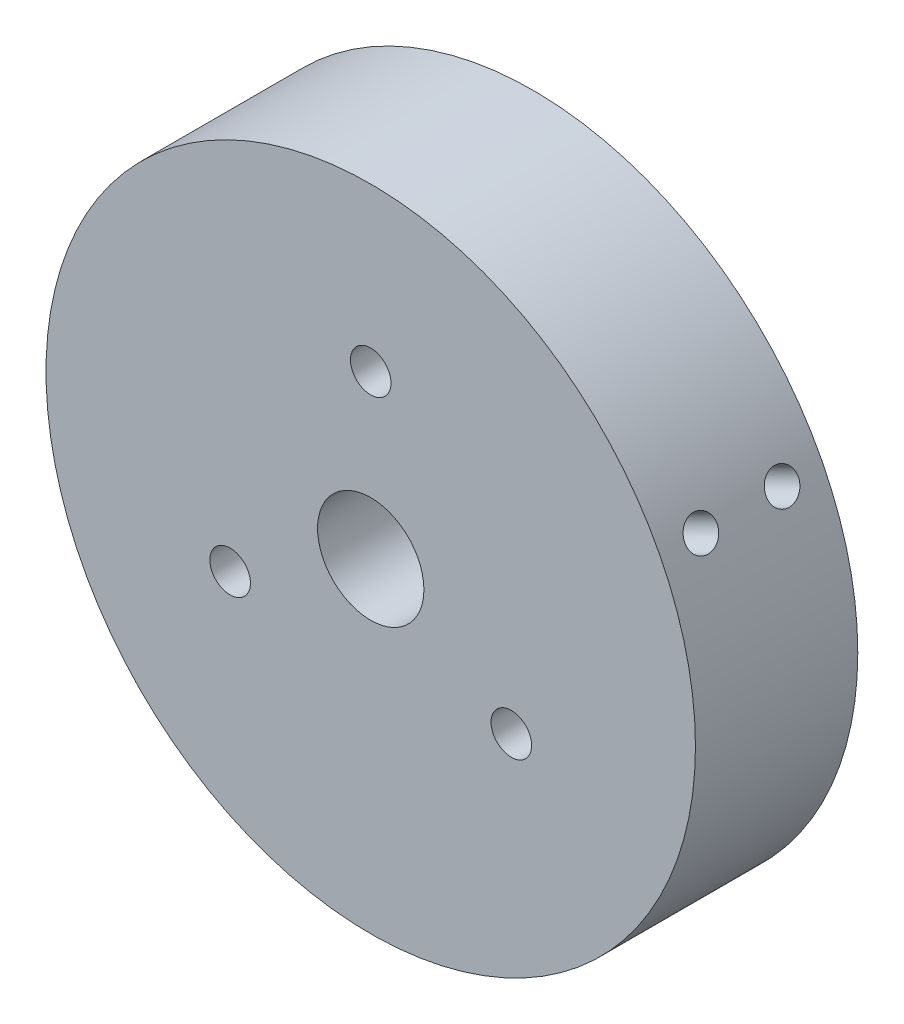
ISO-10303-21;
HEADER;
FILE_DESCRIPTION(('STEP AP214'),'2;1');
FILE_NAME('part.step','',(''),(''),'','','');
FILE_SCHEMA(('AUTOMOTIVE_DESIGN { 1 0 10303 214 1 1 1 1 }'));
ENDSEC;
DATA;
#1=APPLICATION_CONTEXT('core data for automotive mechanical design processes');
#2=APPLICATION_PROTOCOL_DEFINITION('international standard','automotive_design',2000,#1);
#3=PRODUCT_CONTEXT('',#1,'mechanical');
#4=PRODUCT('Part','Part','',(#3));
#5=PRODUCT_RELATED_PRODUCT_CATEGORY('part','',(#4));
#6=PRODUCT_DEFINITION_FORMATION('','',#4);
#7=PRODUCT_DEFINITION_CONTEXT('part definition',#1,'design');
#8=PRODUCT_DEFINITION('design','',#6,#7);
#9=PRODUCT_DEFINITION_SHAPE('','',#8);
#10=(LENGTH_UNIT() NAMED_UNIT(*) SI_UNIT(.MILLI.,.METRE.));
#11=(NAMED_UNIT(*) PLANE_ANGLE_UNIT() SI_UNIT($,.RADIAN.));
#12=(NAMED_UNIT(*) SI_UNIT($,.STERADIAN.) SOLID_ANGLE_UNIT());
#13=UNCERTAINTY_MEASURE_WITH_UNIT(LENGTH_MEASURE(1.E-05),#10,'distance_accuracy_value','');
#14=(GEOMETRIC_REPRESENTATION_CONTEXT(3) GLOBAL_UNCERTAINTY_ASSIGNED_CONTEXT((#13)) GLOBAL_UNIT_ASSIGNED_CONTEXT((#10,
#11,#12)) REPRESENTATION_CONTEXT('',''));
#15=CARTESIAN_POINT('',(0.,0.,0.));
#16=DIRECTION('',(0.,0.,1.));
#17=DIRECTION('',(1.,0.,0.));
#18=AXIS2_PLACEMENT_3D('',#15,#16,#17);
#19=CARTESIAN_POINT('',(0.,0.,10.));
#20=DIRECTION('',(0.,0.,-1.));
#21=DIRECTION('',(-1.,0.,0.));
#22=AXIS2_PLACEMENT_3D('',#19,#20,#21);
#23=CYLINDRICAL_SURFACE('',#22,20.);
#24=CARTESIAN_POINT('',(0.,0.,10.));
#25=DIRECTION('',(0.,0.,1.));
#26=DIRECTION('',(1.,0.,0.));
#27=AXIS2_PLACEMENT_3D('',#24,#25,#26);
#28=CIRCLE('',#27,20.);
#29=CARTESIAN_POINT('',(20.,0.,10.));
#30=VERTEX_POINT('',#29);
#31=EDGE_CURVE('E10',#30,#30,#28,.T.);
#32=ORIENTED_EDGE('',*,*,#31,.F.);
#33=EDGE_LOOP('',(#32));
#34=FACE_BOUND('',#33,.T.);
#35=CARTESIAN_POINT('',(0.,0.,0.));
#36=DIRECTION('',(0.,0.,1.));
#37=DIRECTION('',(1.,0.,0.));
#38=AXIS2_PLACEMENT_3D('',#35,#36,#37);
#39=CIRCLE('',#38,20.);
#40=CARTESIAN_POINT('',(20.,0.,0.));
#41=VERTEX_POINT('',#40);
#42=EDGE_CURVE('E34',#41,#41,#39,.T.);
#43=ORIENTED_EDGE('',*,*,#42,.T.);
#44=EDGE_LOOP('',(#43));
#45=FACE_BOUND('',#44,.T.);
#46=CARTESIAN_POINT('',(18.2698664851172,8.13707432779075,2.5));
#47=CARTESIAN_POINT('',(18.2698656650556,8.13707668950488,2.44386724100331));
#48=CARTESIAN_POINT('',(18.2679362451336,8.14141251511156,2.38769467418249));
#49=CARTESIAN_POINT('',(18.2602492241075,8.15863859973929,2.27689914768219));
#50=CARTESIAN_POINT('',(18.2544871124354,8.17153893801744,2.22227809299435));
#51=CARTESIAN_POINT('',(18.2392477700308,8.2054972508117,2.11620660834029));
#52=CARTESIAN_POINT('',(18.2297724331456,8.2265510667644,2.06475457753963));
#53=CARTESIAN_POINT('',(18.2072985116051,8.27617176825019,1.96646615101335));
#54=CARTESIAN_POINT('',(18.1943007585834,8.30473688033791,1.9196286693589));
#55=CARTESIAN_POINT('',(18.1650372502255,8.36855132432156,1.83183752521596));
#56=CARTESIAN_POINT('',(18.14876861008,8.40380655511825,1.79088911175391));
#57=CARTESIAN_POINT('',(18.1133231846734,8.47993410480662,1.71608322760224));
#58=CARTESIAN_POINT('',(18.0941462807608,8.52080665286746,1.68222604635527));
#59=CARTESIAN_POINT('',(18.0533139844,8.60698118957431,1.62254933043812));
#60=CARTESIAN_POINT('',(18.0316573425674,8.652285409372,1.59673387207366));
#61=CARTESIAN_POINT('',(17.9864003498086,8.74597657478419,1.55389957380047));
#62=CARTESIAN_POINT('',(17.9628000135937,8.79436349706594,1.53688066732015));
#63=CARTESIAN_POINT('',(17.9142851083139,8.89277203021169,1.51213640921778));
#64=CARTESIAN_POINT('',(17.8893716658124,8.94279222624682,1.50440322226672));
#65=CARTESIAN_POINT('',(17.8388915471291,9.04306910388663,1.49842573971104));
#66=CARTESIAN_POINT('',(17.8133248760893,9.09332578362719,1.50018136943452));
#67=CARTESIAN_POINT('',(17.7622949695299,9.1926052181231,1.51312518134678));
#68=CARTESIAN_POINT('',(17.7368316619743,9.2416290358116,1.52430492966836));
#69=CARTESIAN_POINT('',(17.6867490481536,9.33712037510001,1.55576655316963));
#70=CARTESIAN_POINT('',(17.6621297454277,9.38358788598146,1.57604846651092));
#71=CARTESIAN_POINT('',(17.6144929601877,9.47270789258768,1.62514830675197));
#72=CARTESIAN_POINT('',(17.5914762045344,9.51535865963763,1.65397007629031));
#73=CARTESIAN_POINT('',(17.5478011947027,9.59566391533399,1.71932867756906));
#74=CARTESIAN_POINT('',(17.5271429571813,9.63331836869424,1.75586556379231));
#75=CARTESIAN_POINT('',(17.488853233993,9.7026587400493,1.83566492916092));
#76=CARTESIAN_POINT('',(17.4712250857812,9.73433808051635,1.87893472554356));
#77=CARTESIAN_POINT('',(17.4396287015035,9.79083254219458,1.97094593429147));
#78=CARTESIAN_POINT('',(17.4256604664101,9.81564766158186,2.01968734811059));
#79=CARTESIAN_POINT('',(17.4018743624739,9.85775615532461,2.12126265265712));
#80=CARTESIAN_POINT('',(17.3920566277032,9.87504928670066,2.17409667552129));
#81=CARTESIAN_POINT('',(17.3769235784843,9.90165456976516,2.28235542276686));
#82=CARTESIAN_POINT('',(17.3716082301733,9.9109667814788,2.3377801276602));
#83=CARTESIAN_POINT('',(17.3656755139871,9.92135829845139,2.44958268299942));
#84=CARTESIAN_POINT('',(17.3650530661032,9.92244650609998,2.50595943656398));
#85=CARTESIAN_POINT('',(17.368515329859,9.91638477218024,2.618122236779));
#86=CARTESIAN_POINT('',(17.3726000259324,9.90923485785524,2.6739082853823));
#87=CARTESIAN_POINT('',(17.3853254115789,9.88689151278167,2.78327735716357));
#88=CARTESIAN_POINT('',(17.3939637893089,9.8717021635307,2.83686148336144));
#89=CARTESIAN_POINT('',(17.4154858645442,9.83368326279117,2.94033963108083));
#90=CARTESIAN_POINT('',(17.428369586617,9.81085366708923,2.9902336312459));
#91=CARTESIAN_POINT('',(17.4579413803482,9.75813473576173,3.08496231631947));
#92=CARTESIAN_POINT('',(17.4746327148691,9.72823934443713,3.12979261243032));
#93=CARTESIAN_POINT('',(17.5112373808973,9.66219369984117,3.21307717416153));
#94=CARTESIAN_POINT('',(17.5311507330037,9.62604340658078,3.25153139901511));
#95=CARTESIAN_POINT('',(17.5735483889071,9.54842137226089,3.32100664437919));
#96=CARTESIAN_POINT('',(17.596034953813,9.50694494710359,3.35202105220461));
#97=CARTESIAN_POINT('',(17.6428290342629,9.4198208841469,3.40569107091384));
#98=CARTESIAN_POINT('',(17.6671365418809,9.37417326450309,3.42834671817793));
#99=CARTESIAN_POINT('',(17.7167920748025,9.27998433245851,3.46464454287083));
#100=CARTESIAN_POINT('',(17.7421396058021,9.23144438987602,3.47829095070453));
#101=CARTESIAN_POINT('',(17.793115113216,9.13280544654936,3.49619677910743));
#102=CARTESIAN_POINT('',(17.8187430880471,9.08270645460324,3.50045625263933));
#103=CARTESIAN_POINT('',(17.8695061980643,8.98242191183328,3.49946679495351));
#104=CARTESIAN_POINT('',(17.8946418406264,8.9322365151634,3.49422823652193));
#105=CARTESIAN_POINT('',(17.9437552457131,8.83315946359246,3.47441286033208));
#106=CARTESIAN_POINT('',(17.9677330060564,8.78426781112852,3.45983602498397));
#107=CARTESIAN_POINT('',(18.013904385865,8.6891912223976,3.42175999898317));
#108=CARTESIAN_POINT('',(18.0360979922222,8.6430063060175,3.39826074278534));
#109=CARTESIAN_POINT('',(18.0781535086143,8.55469233466697,3.34300873599683));
#110=CARTESIAN_POINT('',(18.0980154901985,8.51256315524745,3.31125623876511));
#111=CARTESIAN_POINT('',(18.1349654585131,8.43356004681135,3.24036196822774));
#112=CARTESIAN_POINT('',(18.1520507011679,8.3966913207071,3.20121296703504));
#113=CARTESIAN_POINT('',(18.1830511957683,8.329347365772,3.11664168112384));
#114=CARTESIAN_POINT('',(18.1969656667385,8.29887371222196,3.07121785530355));
#115=CARTESIAN_POINT('',(18.2213385281724,8.24522250284338,2.97535059395517));
#116=CARTESIAN_POINT('',(18.2317935886077,8.22205197801744,2.92490238236017));
#117=CARTESIAN_POINT('',(18.2490087140092,8.18377209069065,2.82049045540655));
#118=CARTESIAN_POINT('',(18.2557731436256,8.16865320658742,2.76653097751496));
#119=CARTESIAN_POINT('',(18.2637026461476,8.1509029131412,2.67686353887427));
#120=CARTESIAN_POINT('',(18.2660119235591,8.14572421407591,2.6417363728745));
#121=CARTESIAN_POINT('',(18.2690941020448,8.13880917507727,2.57107812569735));
#122=CARTESIAN_POINT('',(18.2698670044354,8.13707283219424,2.5355470448661));
#123=CARTESIAN_POINT('',(18.2698664851172,8.13707432779075,2.5));
#124=B_SPLINE_CURVE_WITH_KNOTS('',3,(#46,#47,#48,#49,#50,#51,#52,#53,#54,#55,#56,#57,#58,#59,
#60,#61,#62,#63,#64,#65,#66,#67,#68,#69,#70,#71,#72,#73,#74,#75,#76,#77,#78,#79,#80,#81,#82,#83,
#84,#85,#86,#87,#88,#89,#90,#91,#92,#93,#94,#95,#96,#97,#98,#99,#100,#101,#102,#103,#104,#105,
#106,#107,#108,#109,#110,#111,#112,#113,#114,#115,#116,#117,#118,#119,#120,#121,#122,#123),
.UNSPECIFIED.,.T.,.F.,(4,2,2,2,2,2,2,2,2,2,2,2,2,2,2,2,2,2,2,2,2,2,2,2,2,2,2,2,2,2,2,2,2,2,2,2,
2,2,4),(0.,0.168268516567257,0.336735413977376,0.505116500205036,0.673457866663186,
0.841948360872467,1.01044573101413,1.17902837309698,1.34760973934149,1.51604875573591,
1.6844864466074,1.85277355842925,2.02106137581585,2.18942503216722,2.35778987751377,
2.52633899424335,2.69488815575804,2.86344276143662,3.03199609938987,3.20036695412688,
3.36873725206615,3.53702215286789,3.70530802753569,3.87373865699995,4.04217036331982,
4.21075122557707,4.37933135410221,4.547832267239,4.71633222966234,4.88464828436399,
5.05296465611123,5.22128226435392,5.38959470617307,5.55807248221313,5.72659171033734,
5.89527268631431,6.06375374032593,6.17031279318987,6.276871754746),.UNSPECIFIED.);
#125=CARTESIAN_POINT('',(18.2698664851172,8.13707432779075,2.5));
#126=VERTEX_POINT('',#125);
#127=EDGE_CURVE('E76',#126,#126,#124,.T.);
#128=ORIENTED_EDGE('',*,*,#127,.F.);
#129=EDGE_LOOP('',(#128));
#130=FACE_BOUND('',#129,.T.);
#131=CARTESIAN_POINT('',(18.2698664851172,8.13707432779075,7.5));
#132=CARTESIAN_POINT('',(18.2698656650556,8.13707668950488,7.44386724100331));
#133=CARTESIAN_POINT('',(18.2679362451336,8.14141251511156,7.38769467418249));
#134=CARTESIAN_POINT('',(18.2602492241075,8.15863859973929,7.27689914768219));
#135=CARTESIAN_POINT('',(18.2544871124354,8.17153893801744,7.22227809299435));
#136=CARTESIAN_POINT('',(18.2392477700308,8.2054972508117,7.11620660834029));
#137=CARTESIAN_POINT('',(18.2297724331456,8.2265510667644,7.06475457753963));
#138=CARTESIAN_POINT('',(18.2072985116051,8.27617176825019,6.96646615101335));
#139=CARTESIAN_POINT('',(18.1943007585834,8.30473688033791,6.9196286693589));
#140=CARTESIAN_POINT('',(18.1650372502255,8.36855132432156,6.83183752521596));
#141=CARTESIAN_POINT('',(18.14876861008,8.40380655511825,6.79088911175391));
#142=CARTESIAN_POINT('',(18.1133231846734,8.47993410480662,6.71608322760224));
#143=CARTESIAN_POINT('',(18.0941462807608,8.52080665286746,6.68222604635527));
#144=CARTESIAN_POINT('',(18.0533139844,8.60698118957431,6.62254933043812));
#145=CARTESIAN_POINT('',(18.0316573425674,8.652285409372,6.59673387207366));
#146=CARTESIAN_POINT('',(17.9864003498086,8.74597657478419,6.55389957380047));
#147=CARTESIAN_POINT('',(17.9628000135937,8.79436349706594,6.53688066732015));
#148=CARTESIAN_POINT('',(17.9142851083139,8.89277203021169,6.51213640921778));
#149=CARTESIAN_POINT('',(17.8893716658124,8.94279222624682,6.50440322226672));
#150=CARTESIAN_POINT('',(17.8388915471291,9.04306910388663,6.49842573971104));
#151=CARTESIAN_POINT('',(17.8133248760893,9.09332578362719,6.50018136943452));
#152=CARTESIAN_POINT('',(17.7622949695299,9.1926052181231,6.51312518134678));
#153=CARTESIAN_POINT('',(17.7368316619743,9.2416290358116,6.52430492966836));
#154=CARTESIAN_POINT('',(17.6867490481536,9.33712037510001,6.55576655316963));
#155=CARTESIAN_POINT('',(17.6621297454277,9.38358788598146,6.57604846651092));
#156=CARTESIAN_POINT('',(17.6144929601877,9.47270789258768,6.62514830675197));
#157=CARTESIAN_POINT('',(17.5914762045344,9.51535865963762,6.65397007629031));
#158=CARTESIAN_POINT('',(17.5478011947027,9.59566391533399,6.71932867756906));
#159=CARTESIAN_POINT('',(17.5271429571813,9.63331836869424,6.75586556379231));
#160=CARTESIAN_POINT('',(17.488853233993,9.7026587400493,6.83566492916092));
#161=CARTESIAN_POINT('',(17.4712250857812,9.73433808051635,6.87893472554356));
#162=CARTESIAN_POINT('',(17.4396287015035,9.79083254219458,6.97094593429147));
#163=CARTESIAN_POINT('',(17.4256604664101,9.81564766158185,7.01968734811059));
#164=CARTESIAN_POINT('',(17.4018743624739,9.8577561553246,7.12126265265712));
#165=CARTESIAN_POINT('',(17.3920566277032,9.87504928670067,7.1740966755213));
#166=CARTESIAN_POINT('',(17.3769235784843,9.90165456976516,7.28235542276686));
#167=CARTESIAN_POINT('',(17.3716082301733,9.91096678147879,7.3377801276602));
#168=CARTESIAN_POINT('',(17.3656755139871,9.92135829845139,7.44958268299942));
#169=CARTESIAN_POINT('',(17.3650530661032,9.92244650609998,7.50595943656397));
#170=CARTESIAN_POINT('',(17.368515329859,9.91638477218024,7.618122236779));
#171=CARTESIAN_POINT('',(17.3726000259324,9.90923485785524,7.6739082853823));
#172=CARTESIAN_POINT('',(17.3853254115789,9.88689151278167,7.78327735716357));
#173=CARTESIAN_POINT('',(17.3939637893089,9.87170216353069,7.83686148336144));
#174=CARTESIAN_POINT('',(17.4154858645442,9.83368326279117,7.94033963108083));
#175=CARTESIAN_POINT('',(17.428369586617,9.81085366708923,7.9902336312459));
#176=CARTESIAN_POINT('',(17.4579413803482,9.75813473576173,8.08496231631947));
#177=CARTESIAN_POINT('',(17.4746327148691,9.72823934443713,8.12979261243032));
#178=CARTESIAN_POINT('',(17.5112373808973,9.66219369984117,8.21307717416152));
#179=CARTESIAN_POINT('',(17.5311507330037,9.62604340658078,8.25153139901511));
#180=CARTESIAN_POINT('',(17.5735483889071,9.54842137226089,8.32100664437919));
#181=CARTESIAN_POINT('',(17.596034953813,9.5069449471036,8.35202105220461));
#182=CARTESIAN_POINT('',(17.6428290342629,9.4198208841469,8.40569107091384));
#183=CARTESIAN_POINT('',(17.6671365418809,9.37417326450309,8.42834671817793));
#184=CARTESIAN_POINT('',(17.7167920748025,9.27998433245851,8.46464454287083));
#185=CARTESIAN_POINT('',(17.7421396058021,9.23144438987602,8.47829095070453));
#186=CARTESIAN_POINT('',(17.793115113216,9.13280544654936,8.49619677910743));
#187=CARTESIAN_POINT('',(17.8187430880471,9.08270645460324,8.50045625263933));
#188=CARTESIAN_POINT('',(17.8695061980643,8.98242191183328,8.49946679495351));
#189=CARTESIAN_POINT('',(17.8946418406264,8.9322365151634,8.49422823652193));
#190=CARTESIAN_POINT('',(17.9437552457131,8.83315946359246,8.47441286033208));
#191=CARTESIAN_POINT('',(17.9677330060564,8.78426781112852,8.45983602498397));
#192=CARTESIAN_POINT('',(18.013904385865,8.6891912223976,8.42175999898317));
#193=CARTESIAN_POINT('',(18.0360979922222,8.6430063060175,8.39826074278534));
#194=CARTESIAN_POINT('',(18.0781535086143,8.55469233466697,8.34300873599683));
#195=CARTESIAN_POINT('',(18.0980154901985,8.51256315524745,8.3112562387651));
#196=CARTESIAN_POINT('',(18.1349654585131,8.43356004681135,8.24036196822774));
#197=CARTESIAN_POINT('',(18.1520507011679,8.39669132070709,8.20121296703504));
#198=CARTESIAN_POINT('',(18.1830511957683,8.329347365772,8.11664168112384));
#199=CARTESIAN_POINT('',(18.1969656667385,8.29887371222196,8.07121785530355));
#200=CARTESIAN_POINT('',(18.2213385281724,8.24522250284338,7.97535059395517));
#201=CARTESIAN_POINT('',(18.2317935886077,8.22205197801745,7.92490238236017));
#202=CARTESIAN_POINT('',(18.2490087140092,8.18377209069066,7.82049045540655));
#203=CARTESIAN_POINT('',(18.2557731436256,8.16865320658742,7.76653097751496));
#204=CARTESIAN_POINT('',(18.2637026461476,8.1509029131412,7.67686353887427));
#205=CARTESIAN_POINT('',(18.2660119235591,8.14572421407591,7.6417363728745));
#206=CARTESIAN_POINT('',(18.2690941020448,8.13880917507727,7.57107812569735));
#207=CARTESIAN_POINT('',(18.2698670044354,8.13707283219424,7.5355470448661));
#208=CARTESIAN_POINT('',(18.2698664851172,8.13707432779075,7.5));
#209=B_SPLINE_CURVE_WITH_KNOTS('',3,(#131,#132,#133,#134,#135,#136,#137,#138,#139,#140,#141,
#142,#143,#144,#145,#146,#147,#148,#149,#150,#151,#152,#153,#154,#155,#156,#157,#158,#159,#160,
#161,#162,#163,#164,#165,#166,#167,#168,#169,#170,#171,#172,#173,#174,#175,#176,#177,#178,#179,
#180,#181,#182,#183,#184,#185,#186,#187,#188,#189,#190,#191,#192,#193,#194,#195,#196,#197,#198,
#199,#200,#201,#202,#203,#204,#205,#206,#207,#208),.UNSPECIFIED.,.T.,.F.,(4,2,2,2,2,2,2,2,2,2,2,
2,2,2,2,2,2,2,2,2,2,2,2,2,2,2,2,2,2,2,2,2,2,2,2,2,2,2,4),(0.,0.168268516567257,
0.336735413977376,0.505116500205035,0.673457866663185,0.841948360872465,1.01044573101413,
1.17902837309698,1.34760973934149,1.51604875573591,1.6844864466074,1.85277355842925,
2.02106137581585,2.18942503216721,2.35778987751377,2.52633899424335,2.69488815575804,
2.86344276143662,3.03199609938986,3.20036695412688,3.36873725206614,3.53702215286789,
3.70530802753569,3.87373865699994,4.04217036331982,4.21075122557706,4.3793313541022,
4.54783226723899,4.71633222966233,4.88464828436398,5.05296465611123,5.22128226435392,
5.38959470617307,5.55807248221313,5.72659171033733,5.89527268631431,6.06375374032593,
6.17031279318987,6.276871754746),.UNSPECIFIED.);
#210=CARTESIAN_POINT('',(18.2698664851172,8.13707432779075,7.5));
#211=VERTEX_POINT('',#210);
#212=EDGE_CURVE('E75',#211,#211,#209,.T.);
#213=ORIENTED_EDGE('',*,*,#212,.F.);
#214=EDGE_LOOP('',(#213));
#215=FACE_BOUND('',#214,.T.);
#216=ADVANCED_FACE('F31',(#34,#45,#130,#215),#23,.T.);
#217=CARTESIAN_POINT('',(0.,0.,10.));
#218=DIRECTION('',(0.,0.,-1.));
#219=DIRECTION('',(-1.,0.,0.));
#220=AXIS2_PLACEMENT_3D('',#217,#218,#219);
#221=CYLINDRICAL_SURFACE('',#220,3.275);
#222=CARTESIAN_POINT('',(2.32979097217766,2.30167309276523,2.5));
#223=CARTESIAN_POINT('',(2.32979164666574,2.30167281336672,2.4452537602253));
#224=CARTESIAN_POINT('',(2.33313001388214,2.29830799645622,2.3905020313929));
#225=CARTESIAN_POINT('',(2.34624551129864,2.28491627439694,2.28260259615405));
#226=CARTESIAN_POINT('',(2.35602461704027,2.27488732517755,2.22945538712802));
#227=CARTESIAN_POINT('',(2.38133422440516,2.24837822289333,2.12634299136384));
#228=CARTESIAN_POINT('',(2.39685490115369,2.23190908742924,2.07637253880128));
#229=CARTESIAN_POINT('',(2.43269991464427,2.19278302399342,1.98076953095194));
#230=CARTESIAN_POINT('',(2.45302502595494,2.17012509817621,1.93513767679702));
#231=CARTESIAN_POINT('',(2.49803418767822,2.11817450710033,1.84801093879038));
#232=CARTESIAN_POINT('',(2.52282982709342,2.08870468060368,1.8066792984243));
#233=CARTESIAN_POINT('',(2.57506494321571,2.02395491026348,1.73078204911099));
#234=CARTESIAN_POINT('',(2.60250477123835,1.98867419392323,1.69621734109519));
#235=CARTESIAN_POINT('',(2.65933302172943,1.91203906287981,1.63412140113247));
#236=CARTESIAN_POINT('',(2.68875065078518,1.87057039666767,1.60675732066121));
#237=CARTESIAN_POINT('',(2.74761051173504,1.78298640643889,1.56093815883177));
#238=CARTESIAN_POINT('',(2.77705273664251,1.73687212529891,1.54248108333651));
#239=CARTESIAN_POINT('',(2.83382360004,1.64256118594102,1.51554212843931));
#240=CARTESIAN_POINT('',(2.86118899219576,1.59446640913337,1.50678145083648));
#241=CARTESIAN_POINT('',(2.91371499435635,1.49632377256248,1.49860165610499));
#242=CARTESIAN_POINT('',(2.93887608234821,1.44627633963725,1.49918050870219));
#243=CARTESIAN_POINT('',(2.98545674739629,1.3474279511754,1.50947778361065));
#244=CARTESIAN_POINT('',(3.0069723510861,1.29864032126694,1.51889415848504));
#245=CARTESIAN_POINT('',(3.0468419083207,1.20212614386663,1.54610485156707));
#246=CARTESIAN_POINT('',(3.06519565888392,1.15439966466866,1.5638997073747));
#247=CARTESIAN_POINT('',(3.09881898736415,1.06087093810307,1.6075623120457));
#248=CARTESIAN_POINT('',(3.11404924961191,1.01509836062612,1.6335236408634));
#249=CARTESIAN_POINT('',(3.1412697624128,0.927447407085535,1.69270778271423));
#250=CARTESIAN_POINT('',(3.15325922093351,0.88556998461093,1.72593236726014));
#251=CARTESIAN_POINT('',(3.17470242188038,0.805407315828616,1.80025977241514));
#252=CARTESIAN_POINT('',(3.18403599482885,0.767331882129287,1.84162390165146));
#253=CARTESIAN_POINT('',(3.19993292781576,0.698083006432946,1.93025332379727));
#254=CARTESIAN_POINT('',(3.20649599162349,0.666910302664761,1.97751924704355));
#255=CARTESIAN_POINT('',(3.21735434035745,0.612404773101699,2.07726593505105));
#256=CARTESIAN_POINT('',(3.22162569713473,0.589155559550374,2.12979517525102));
#257=CARTESIAN_POINT('',(3.22819771444564,0.552018383473779,2.23817841585899));
#258=CARTESIAN_POINT('',(3.23049904528673,0.538127237179974,2.29403127847056));
#259=CARTESIAN_POINT('',(3.2333442004284,0.520754518453056,2.40517160992827));
#260=CARTESIAN_POINT('',(3.23395228568574,0.516892719689807,2.46039803937554));
#261=CARTESIAN_POINT('',(3.23366754004988,0.518671770118082,2.57068844753783));
#262=CARTESIAN_POINT('',(3.2327749283657,0.524311231446803,2.62575244880205));
#263=CARTESIAN_POINT('',(3.22943024423569,0.544522038895858,2.73259832048395));
#264=CARTESIAN_POINT('',(3.22702125923064,0.558846209615896,2.78442872804033));
#265=CARTESIAN_POINT('',(3.22044500802785,0.595570844765104,2.88502287001306));
#266=CARTESIAN_POINT('',(3.21627746376641,0.617972586339736,2.93378611804783));
#267=CARTESIAN_POINT('',(3.20570476738429,0.670687418458805,3.02835191419147));
#268=CARTESIAN_POINT('',(3.199240979807,0.701201970861785,3.0740354542226));
#269=CARTESIAN_POINT('',(3.18369249992065,0.768716459701375,3.15983061284866));
#270=CARTESIAN_POINT('',(3.17460715728373,0.805718004468074,3.19994084521362));
#271=CARTESIAN_POINT('',(3.15300637261428,0.886561331843139,3.27507568335534));
#272=CARTESIAN_POINT('',(3.14037016832215,0.930614775084627,3.30983849971131));
#273=CARTESIAN_POINT('',(3.11151288565249,1.02296099261458,3.37132609847358));
#274=CARTESIAN_POINT('',(3.0952919801532,1.07125356239636,3.39805126836222));
#275=CARTESIAN_POINT('',(3.05927997665605,1.17011749814876,3.44244729238444));
#276=CARTESIAN_POINT('',(3.03951678507693,1.22066888525271,3.46018504404139));
#277=CARTESIAN_POINT('',(2.99652003254554,1.32270673378013,3.48626832248809));
#278=CARTESIAN_POINT('',(2.9732875059983,1.37419291248362,3.49461664249019));
#279=CARTESIAN_POINT('',(2.92486686636354,1.47436460839075,3.50146549395432));
#280=CARTESIAN_POINT('',(2.89979350310508,1.52307999607418,3.50034502380115));
#281=CARTESIAN_POINT('',(2.84769496775151,1.61839677090559,3.48919856159051));
#282=CARTESIAN_POINT('',(2.820669913324,1.66499828522381,3.47917310600413));
#283=CARTESIAN_POINT('',(2.76596649117269,1.75435749889894,3.45073875291255));
#284=CARTESIAN_POINT('',(2.73829917421251,1.79715315984153,3.43242734475326));
#285=CARTESIAN_POINT('',(2.6830886337,1.87858543772,3.38802841188998));
#286=CARTESIAN_POINT('',(2.65554543172393,1.91722135636539,3.36193958436255));
#287=CARTESIAN_POINT('',(2.60083327375666,1.99084532912381,3.30173447215909));
#288=CARTESIAN_POINT('',(2.57370628220836,2.0256720053985,3.26738278902465));
#289=CARTESIAN_POINT('',(2.52205307260131,2.08963315945581,3.19204728388523));
#290=CARTESIAN_POINT('',(2.49752761930282,2.11876596555071,3.15106152058976));
#291=CARTESIAN_POINT('',(2.45162011769839,2.17173959858924,3.06208742406078));
#292=CARTESIAN_POINT('',(2.43036001837663,2.19538695569318,3.01392050716929));
#293=CARTESIAN_POINT('',(2.39322877337863,2.23580827488214,2.91286567115628));
#294=CARTESIAN_POINT('',(2.37735520943155,2.25258532207603,2.85997988406305));
#295=CARTESIAN_POINT('',(2.35331317780285,2.27767733458587,2.75634291178037));
#296=CARTESIAN_POINT('',(2.34454062512474,2.2866620737226,2.70589303028423));
#297=CARTESIAN_POINT('',(2.33277983655315,2.29865943102596,2.60363020431367));
#298=CARTESIAN_POINT('',(2.32979033377167,2.30167335721716,2.55181756089987));
#299=CARTESIAN_POINT('',(2.32979097217766,2.30167309276523,2.5));
#300=B_SPLINE_CURVE_WITH_KNOTS('',3,(#222,#223,#224,#225,#226,#227,#228,#229,#230,#231,#232,
#233,#234,#235,#236,#237,#238,#239,#240,#241,#242,#243,#244,#245,#246,#247,#248,#249,#250,#251,
#252,#253,#254,#255,#256,#257,#258,#259,#260,#261,#262,#263,#264,#265,#266,#267,#268,#269,#270,
#271,#272,#273,#274,#275,#276,#277,#278,#279,#280,#281,#282,#283,#284,#285,#286,#287,#288,#289,
#290,#291,#292,#293,#294,#295,#296,#297,#298,#299),.UNSPECIFIED.,.T.,.F.,(4,2,2,2,2,2,2,2,2,2,2,
2,2,2,2,2,2,2,2,2,2,2,2,2,2,2,2,2,2,2,2,2,2,2,2,2,2,2,4),(0.,0.164047460823636,
0.328145262705684,0.491963552527085,0.655808271088538,0.82452214602784,0.9932584678328,
1.1656217135316,1.33794635191102,1.5051759280027,1.67236915137642,1.83404843658929,
1.99573809726653,2.15935255096621,2.32300695494822,2.49318681451993,2.66338486559955,
2.83532701336364,3.00721063399621,3.172475853941,3.33771693544904,3.49846246089171,
3.65923341297653,3.82444581973846,3.9896992459461,4.16144661914482,4.33318571134438,
4.50362696552914,4.67401750262481,4.83762129215934,5.00121522623134,5.16293250409373,
5.32467688703427,5.49173071847038,5.65883352252185,5.83114995877073,6.0033889313436,
6.15869461355951,6.31396626923269),.UNSPECIFIED.);
#301=CARTESIAN_POINT('',(2.32979097217766,2.30167309276523,2.5));
#302=VERTEX_POINT('',#301);
#303=EDGE_CURVE('E67',#302,#302,#300,.T.);
#304=ORIENTED_EDGE('',*,*,#303,.F.);
#305=EDGE_LOOP('',(#304));
#306=FACE_BOUND('',#305,.T.);
#307=CARTESIAN_POINT('',(0.,0.,10.));
#308=DIRECTION('',(0.,0.,1.));
#309=DIRECTION('',(1.,0.,0.));
#310=AXIS2_PLACEMENT_3D('',#307,#308,#309);
#311=CIRCLE('',#310,3.275);
#312=CARTESIAN_POINT('',(3.275,0.,10.));
#313=VERTEX_POINT('',#312);
#314=EDGE_CURVE('E58',#313,#313,#311,.T.);
#315=ORIENTED_EDGE('',*,*,#314,.T.);
#316=EDGE_LOOP('',(#315));
#317=FACE_BOUND('',#316,.T.);
#318=CARTESIAN_POINT('',(0.,0.,0.));
#319=DIRECTION('',(0.,0.,1.));
#320=DIRECTION('',(1.,0.,0.));
#321=AXIS2_PLACEMENT_3D('',#318,#319,#320);
#322=CIRCLE('',#321,3.275);
#323=CARTESIAN_POINT('',(3.275,0.,0.));
#324=VERTEX_POINT('',#323);
#325=EDGE_CURVE('E61',#324,#324,#322,.T.);
#326=ORIENTED_EDGE('',*,*,#325,.F.);
#327=EDGE_LOOP('',(#326));
#328=FACE_BOUND('',#327,.T.);
#329=CARTESIAN_POINT('',(2.32979097217766,2.30167309276523,7.5));
#330=CARTESIAN_POINT('',(2.32979164666574,2.30167281336672,7.4452537602253));
#331=CARTESIAN_POINT('',(2.33313001388214,2.29830799645622,7.3905020313929));
#332=CARTESIAN_POINT('',(2.34624551129864,2.28491627439694,7.28260259615405));
#333=CARTESIAN_POINT('',(2.35602461704027,2.27488732517755,7.22945538712802));
#334=CARTESIAN_POINT('',(2.38133422440516,2.24837822289333,7.12634299136384));
#335=CARTESIAN_POINT('',(2.39685490115369,2.23190908742924,7.07637253880128));
#336=CARTESIAN_POINT('',(2.43269991464427,2.19278302399342,6.98076953095194));
#337=CARTESIAN_POINT('',(2.45302502595494,2.17012509817621,6.93513767679702));
#338=CARTESIAN_POINT('',(2.49803418767822,2.11817450710033,6.84801093879038));
#339=CARTESIAN_POINT('',(2.52282982709342,2.08870468060368,6.8066792984243));
#340=CARTESIAN_POINT('',(2.57506494321571,2.02395491026348,6.73078204911099));
#341=CARTESIAN_POINT('',(2.60250477123835,1.98867419392323,6.69621734109519));
#342=CARTESIAN_POINT('',(2.65933302172943,1.91203906287981,6.63412140113247));
#343=CARTESIAN_POINT('',(2.68875065078518,1.87057039666767,6.60675732066121));
#344=CARTESIAN_POINT('',(2.74761051173505,1.78298640643889,6.56093815883177));
#345=CARTESIAN_POINT('',(2.77705273664251,1.73687212529891,6.54248108333651));
#346=CARTESIAN_POINT('',(2.83382360004,1.64256118594102,6.51554212843931));
#347=CARTESIAN_POINT('',(2.86118899219576,1.59446640913337,6.50678145083648));
#348=CARTESIAN_POINT('',(2.91371499435635,1.49632377256248,6.49860165610499));
#349=CARTESIAN_POINT('',(2.93887608234821,1.44627633963725,6.49918050870219));
#350=CARTESIAN_POINT('',(2.98545674739629,1.3474279511754,6.50947778361065));
#351=CARTESIAN_POINT('',(3.0069723510861,1.29864032126694,6.51889415848504));
#352=CARTESIAN_POINT('',(3.0468419083207,1.20212614386663,6.54610485156707));
#353=CARTESIAN_POINT('',(3.06519565888392,1.15439966466866,6.5638997073747));
#354=CARTESIAN_POINT('',(3.09881898736415,1.06087093810307,6.6075623120457));
#355=CARTESIAN_POINT('',(3.11404924961191,1.01509836062612,6.63352364086341));
#356=CARTESIAN_POINT('',(3.1412697624128,0.927447407085536,6.69270778271423));
#357=CARTESIAN_POINT('',(3.15325922093351,0.885569984610931,6.72593236726014));
#358=CARTESIAN_POINT('',(3.17470242188038,0.805407315828617,6.80025977241514));
#359=CARTESIAN_POINT('',(3.18403599482885,0.767331882129288,6.84162390165146));
#360=CARTESIAN_POINT('',(3.19993292781576,0.698083006432947,6.93025332379727));
#361=CARTESIAN_POINT('',(3.20649599162349,0.666910302664761,6.97751924704355));
#362=CARTESIAN_POINT('',(3.21735434035745,0.612404773101699,7.07726593505105));
#363=CARTESIAN_POINT('',(3.22162569713473,0.589155559550375,7.12979517525102));
#364=CARTESIAN_POINT('',(3.22819771444564,0.552018383473781,7.23817841585899));
#365=CARTESIAN_POINT('',(3.23049904528673,0.538127237179975,7.29403127847056));
#366=CARTESIAN_POINT('',(3.2333442004284,0.520754518453056,7.40517160992827));
#367=CARTESIAN_POINT('',(3.23395228568574,0.516892719689808,7.46039803937554));
#368=CARTESIAN_POINT('',(3.23366754004988,0.518671770118083,7.57068844753783));
#369=CARTESIAN_POINT('',(3.2327749283657,0.524311231446805,7.62575244880206));
#370=CARTESIAN_POINT('',(3.22943024423569,0.54452203889586,7.73259832048395));
#371=CARTESIAN_POINT('',(3.22702125923064,0.558846209615899,7.78442872804033));
#372=CARTESIAN_POINT('',(3.22044500802785,0.595570844765106,7.88502287001306));
#373=CARTESIAN_POINT('',(3.21627746376641,0.617972586339739,7.93378611804784));
#374=CARTESIAN_POINT('',(3.20570476738429,0.670687418458808,8.02835191419147));
#375=CARTESIAN_POINT('',(3.199240979807,0.701201970861787,8.0740354542226));
#376=CARTESIAN_POINT('',(3.18369249992065,0.768716459701377,8.15983061284866));
#377=CARTESIAN_POINT('',(3.17460715728373,0.805718004468077,8.19994084521362));
#378=CARTESIAN_POINT('',(3.15300637261428,0.886561331843141,8.27507568335534));
#379=CARTESIAN_POINT('',(3.14037016832215,0.930614775084627,8.30983849971131));
#380=CARTESIAN_POINT('',(3.11151288565249,1.02296099261458,8.37132609847358));
#381=CARTESIAN_POINT('',(3.0952919801532,1.07125356239636,8.39805126836222));
#382=CARTESIAN_POINT('',(3.05927997665605,1.17011749814877,8.44244729238444));
#383=CARTESIAN_POINT('',(3.03951678507693,1.22066888525272,8.46018504404138));
#384=CARTESIAN_POINT('',(2.99652003254554,1.32270673378013,8.48626832248809));
#385=CARTESIAN_POINT('',(2.9732875059983,1.37419291248362,8.49461664249019));
#386=CARTESIAN_POINT('',(2.92486686636354,1.47436460839076,8.50146549395432));
#387=CARTESIAN_POINT('',(2.89979350310508,1.52307999607418,8.50034502380115));
#388=CARTESIAN_POINT('',(2.84769496775151,1.6183967709056,8.4891985615905));
#389=CARTESIAN_POINT('',(2.820669913324,1.66499828522381,8.47917310600412));
#390=CARTESIAN_POINT('',(2.76596649117269,1.75435749889894,8.45073875291255));
#391=CARTESIAN_POINT('',(2.73829917421251,1.79715315984153,8.43242734475326));
#392=CARTESIAN_POINT('',(2.6830886337,1.87858543772,8.38802841188997));
#393=CARTESIAN_POINT('',(2.65554543172393,1.9172213563654,8.36193958436255));
#394=CARTESIAN_POINT('',(2.60083327375666,1.99084532912381,8.30173447215909));
#395=CARTESIAN_POINT('',(2.57370628220835,2.0256720053985,8.26738278902464));
#396=CARTESIAN_POINT('',(2.52205307260131,2.08963315945581,8.19204728388523));
#397=CARTESIAN_POINT('',(2.49752761930282,2.11876596555071,8.15106152058976));
#398=CARTESIAN_POINT('',(2.45162011769839,2.17173959858924,8.06208742406078));
#399=CARTESIAN_POINT('',(2.43036001837663,2.19538695569318,8.01392050716929));
#400=CARTESIAN_POINT('',(2.39322877337863,2.23580827488214,7.91286567115628));
#401=CARTESIAN_POINT('',(2.37735520943155,2.25258532207603,7.85997988406305));
#402=CARTESIAN_POINT('',(2.35331317780285,2.27767733458587,7.75634291178037));
#403=CARTESIAN_POINT('',(2.34454062512474,2.2866620737226,7.70589303028423));
#404=CARTESIAN_POINT('',(2.33277983655315,2.29865943102596,7.60363020431367));
#405=CARTESIAN_POINT('',(2.32979033377168,2.30167335721716,7.55181756089987));
#406=CARTESIAN_POINT('',(2.32979097217766,2.30167309276523,7.5));
#407=B_SPLINE_CURVE_WITH_KNOTS('',3,(#329,#330,#331,#332,#333,#334,#335,#336,#337,#338,#339,
#340,#341,#342,#343,#344,#345,#346,#347,#348,#349,#350,#351,#352,#353,#354,#355,#356,#357,#358,
#359,#360,#361,#362,#363,#364,#365,#366,#367,#368,#369,#370,#371,#372,#373,#374,#375,#376,#377,
#378,#379,#380,#381,#382,#383,#384,#385,#386,#387,#388,#389,#390,#391,#392,#393,#394,#395,#396,
#397,#398,#399,#400,#401,#402,#403,#404,#405,#406),.UNSPECIFIED.,.T.,.F.,(4,2,2,2,2,2,2,2,2,2,2,
2,2,2,2,2,2,2,2,2,2,2,2,2,2,2,2,2,2,2,2,2,2,2,2,2,2,2,4),(0.,0.164047460823636,
0.328145262705684,0.491963552527086,0.655808271088538,0.82452214602784,0.9932584678328,
1.1656217135316,1.33794635191102,1.5051759280027,1.67236915137642,1.83404843658928,
1.99573809726653,2.15935255096621,2.32300695494822,2.49318681451993,2.66338486559955,
2.83532701336363,3.00721063399621,3.172475853941,3.33771693544904,3.49846246089171,
3.65923341297653,3.82444581973846,3.9896992459461,4.16144661914482,4.33318571134438,
4.50362696552914,4.67401750262481,4.83762129215934,5.00121522623133,5.16293250409373,
5.32467688703427,5.49173071847038,5.65883352252184,5.83114995877073,6.0033889313436,
6.1586946135595,6.31396626923268),.UNSPECIFIED.);
#408=CARTESIAN_POINT('',(2.32979097217766,2.30167309276523,7.5));
#409=VERTEX_POINT('',#408);
#410=EDGE_CURVE('E64',#409,#409,#407,.T.);
#411=ORIENTED_EDGE('',*,*,#410,.F.);
#412=EDGE_LOOP('',(#411));
#413=FACE_BOUND('',#412,.T.);
#414=ADVANCED_FACE('F113',(#306,#317,#328,#413),#221,.F.);
#415=CARTESIAN_POINT('',(0.,0.,10.));
#416=DIRECTION('',(0.,0.,1.));
#417=DIRECTION('',(1.,0.,0.));
#418=AXIS2_PLACEMENT_3D('',#415,#416,#417);
#419=PLANE('',#418);
#420=CARTESIAN_POINT('',(0.,10.,10.));
#421=DIRECTION('',(0.,0.,1.));
#422=DIRECTION('',(1.,0.,0.));
#423=AXIS2_PLACEMENT_3D('',#420,#421,#422);
#424=CIRCLE('',#423,1.2504794715155);
#425=CARTESIAN_POINT('',(1.2504794715155,10.,10.));
#426=VERTEX_POINT('',#425);
#427=EDGE_CURVE('E52',#426,#426,#424,.T.);
#428=ORIENTED_EDGE('',*,*,#427,.F.);
#429=EDGE_LOOP('',(#428));
#430=FACE_BOUND('',#429,.T.);
#431=CARTESIAN_POINT('',(8.66025403784503,-4.99999999999963,10.));
#432=DIRECTION('',(0.,0.,1.));
#433=DIRECTION('',(1.,0.,0.));
#434=AXIS2_PLACEMENT_3D('',#431,#432,#433);
#435=CIRCLE('',#434,1.25047947151605);
#436=CARTESIAN_POINT('',(9.91073350936107,-4.99999999999963,10.));
#437=VERTEX_POINT('',#436);
#438=EDGE_CURVE('E41',#437,#437,#435,.T.);
#439=ORIENTED_EDGE('',*,*,#438,.F.);
#440=EDGE_LOOP('',(#439));
#441=FACE_BOUND('',#440,.T.);
#442=ORIENTED_EDGE('',*,*,#31,.T.);
#443=EDGE_LOOP('',(#442));
#444=FACE_BOUND('',#443,.T.);
#445=CARTESIAN_POINT('',(-8.66025403784375,-5.00000000000037,10.));
#446=DIRECTION('',(0.,0.,1.));
#447=DIRECTION('',(1.,0.,0.));
#448=AXIS2_PLACEMENT_3D('',#445,#446,#447);
#449=CIRCLE('',#448,1.25047947151631);
#450=CARTESIAN_POINT('',(-7.40977456632744,-5.00000000000037,10.));
#451=VERTEX_POINT('',#450);
#452=EDGE_CURVE('E46',#451,#451,#449,.T.);
#453=ORIENTED_EDGE('',*,*,#452,.F.);
#454=EDGE_LOOP('',(#453));
#455=FACE_BOUND('',#454,.T.);
#456=ORIENTED_EDGE('',*,*,#314,.F.);
#457=EDGE_LOOP('',(#456));
#458=FACE_BOUND('',#457,.T.);
#459=ADVANCED_FACE('F118',(#430,#441,#444,#455,#458),#419,.T.);
#460=CARTESIAN_POINT('',(0.,0.,0.));
#461=DIRECTION('',(0.,0.,1.));
#462=DIRECTION('',(1.,0.,0.));
#463=AXIS2_PLACEMENT_3D('',#460,#461,#462);
#464=PLANE('',#463);
#465=ORIENTED_EDGE('',*,*,#42,.F.);
#466=EDGE_LOOP('',(#465));
#467=FACE_BOUND('',#466,.T.);
#468=CARTESIAN_POINT('',(8.66025403784503,-4.99999999999963,0.));
#469=DIRECTION('',(0.,0.,1.));
#470=DIRECTION('',(1.,0.,0.));
#471=AXIS2_PLACEMENT_3D('',#468,#469,#470);
#472=CIRCLE('',#471,1.25047947151605);
#473=CARTESIAN_POINT('',(9.91073350936107,-4.99999999999963,0.));
#474=VERTEX_POINT('',#473);
#475=EDGE_CURVE('E43',#474,#474,#472,.T.);
#476=ORIENTED_EDGE('',*,*,#475,.T.);
#477=EDGE_LOOP('',(#476));
#478=FACE_BOUND('',#477,.T.);
#479=CARTESIAN_POINT('',(-8.66025403784375,-5.00000000000037,0.));
#480=DIRECTION('',(0.,0.,1.));
#481=DIRECTION('',(1.,0.,0.));
#482=AXIS2_PLACEMENT_3D('',#479,#480,#481);
#483=CIRCLE('',#482,1.25047947151631);
#484=CARTESIAN_POINT('',(-7.40977456632744,-5.00000000000037,0.));
#485=VERTEX_POINT('',#484);
#486=EDGE_CURVE('E49',#485,#485,#483,.T.);
#487=ORIENTED_EDGE('',*,*,#486,.T.);
#488=EDGE_LOOP('',(#487));
#489=FACE_BOUND('',#488,.T.);
#490=CARTESIAN_POINT('',(0.,10.,0.));
#491=DIRECTION('',(0.,0.,1.));
#492=DIRECTION('',(1.,0.,0.));
#493=AXIS2_PLACEMENT_3D('',#490,#491,#492);
#494=CIRCLE('',#493,1.2504794715155);
#495=CARTESIAN_POINT('',(1.2504794715155,10.,0.));
#496=VERTEX_POINT('',#495);
#497=EDGE_CURVE('E55',#496,#496,#494,.T.);
#498=ORIENTED_EDGE('',*,*,#497,.T.);
#499=EDGE_LOOP('',(#498));
#500=FACE_BOUND('',#499,.T.);
#501=ORIENTED_EDGE('',*,*,#325,.T.);
#502=EDGE_LOOP('',(#501));
#503=FACE_BOUND('',#502,.T.);
#504=ADVANCED_FACE('F143',(#467,#478,#489,#500,#503),#464,.F.);
#505=CARTESIAN_POINT('',(8.66025403784503,-4.99999999999963,10.));
#506=DIRECTION('',(0.,0.,-1.));
#507=DIRECTION('',(-1.,0.,0.));
#508=AXIS2_PLACEMENT_3D('',#505,#506,#507);
#509=CYLINDRICAL_SURFACE('',#508,1.25047947151605);
#510=ORIENTED_EDGE('',*,*,#438,.T.);
#511=EDGE_LOOP('',(#510));
#512=FACE_BOUND('',#511,.T.);
#513=ORIENTED_EDGE('',*,*,#475,.F.);
#514=EDGE_LOOP('',(#513));
#515=FACE_BOUND('',#514,.T.);
#516=ADVANCED_FACE('F145',(#512,#515),#509,.F.);
#517=CARTESIAN_POINT('',(-8.66025403784375,-5.00000000000037,10.));
#518=DIRECTION('',(0.,0.,-1.));
#519=DIRECTION('',(-1.,0.,0.));
#520=AXIS2_PLACEMENT_3D('',#517,#518,#519);
#521=CYLINDRICAL_SURFACE('',#520,1.25047947151631);
#522=ORIENTED_EDGE('',*,*,#452,.T.);
#523=EDGE_LOOP('',(#522));
#524=FACE_BOUND('',#523,.T.);
#525=ORIENTED_EDGE('',*,*,#486,.F.);
#526=EDGE_LOOP('',(#525));
#527=FACE_BOUND('',#526,.T.);
#528=ADVANCED_FACE('F132',(#524,#527),#521,.F.);
#529=CARTESIAN_POINT('',(0.,10.,10.));
#530=DIRECTION('',(0.,0.,-1.));
#531=DIRECTION('',(-1.,0.,0.));
#532=AXIS2_PLACEMENT_3D('',#529,#530,#531);
#533=CYLINDRICAL_SURFACE('',#532,1.2504794715155);
#534=ORIENTED_EDGE('',*,*,#427,.T.);
#535=EDGE_LOOP('',(#534));
#536=FACE_BOUND('',#535,.T.);
#537=ORIENTED_EDGE('',*,*,#497,.F.);
#538=EDGE_LOOP('',(#537));
#539=FACE_BOUND('',#538,.T.);
#540=ADVANCED_FACE('F127',(#536,#539),#533,.F.);
#541=CARTESIAN_POINT('',(-23.9788670368948,-12.1511407142646,2.5));
#542=DIRECTION('',(0.892008057220924,0.452019497204438,0.));
#543=DIRECTION('',(-0.452019497204438,0.892008057220924,0.));
#544=AXIS2_PLACEMENT_3D('',#541,#542,#543);
#545=CYLINDRICAL_SURFACE('',#544,1.);
#546=ORIENTED_EDGE('',*,*,#303,.T.);
#547=EDGE_LOOP('',(#546));
#548=FACE_BOUND('',#547,.T.);
#549=ORIENTED_EDGE('',*,*,#127,.T.);
#550=EDGE_LOOP('',(#549));
#551=FACE_BOUND('',#550,.T.);
#552=ADVANCED_FACE('F83',(#548,#551),#545,.F.);
#553=CARTESIAN_POINT('',(-23.9788670368948,-12.1511407142646,7.5));
#554=DIRECTION('',(0.892008057220924,0.452019497204438,0.));
#555=DIRECTION('',(-0.452019497204438,0.892008057220924,0.));
#556=AXIS2_PLACEMENT_3D('',#553,#554,#555);
#557=CYLINDRICAL_SURFACE('',#556,1.);
#558=ORIENTED_EDGE('',*,*,#410,.T.);
#559=EDGE_LOOP('',(#558));
#560=FACE_BOUND('',#559,.T.);
#561=ORIENTED_EDGE('',*,*,#212,.T.);
#562=EDGE_LOOP('',(#561));
#563=FACE_BOUND('',#562,.T.);
#564=ADVANCED_FACE('F90',(#560,#563),#557,.F.);
#565=CLOSED_SHELL('',(#216,#414,#459,#504,#516,#528,#540,#552,#564));
#566=MANIFOLD_SOLID_BREP('B2',#565);
#567=ADVANCED_BREP_SHAPE_REPRESENTATION('',(#18,#566),#14);
#568=SHAPE_DEFINITION_REPRESENTATION(#9,#567);
ENDSEC;
END-ISO-10303-21;
